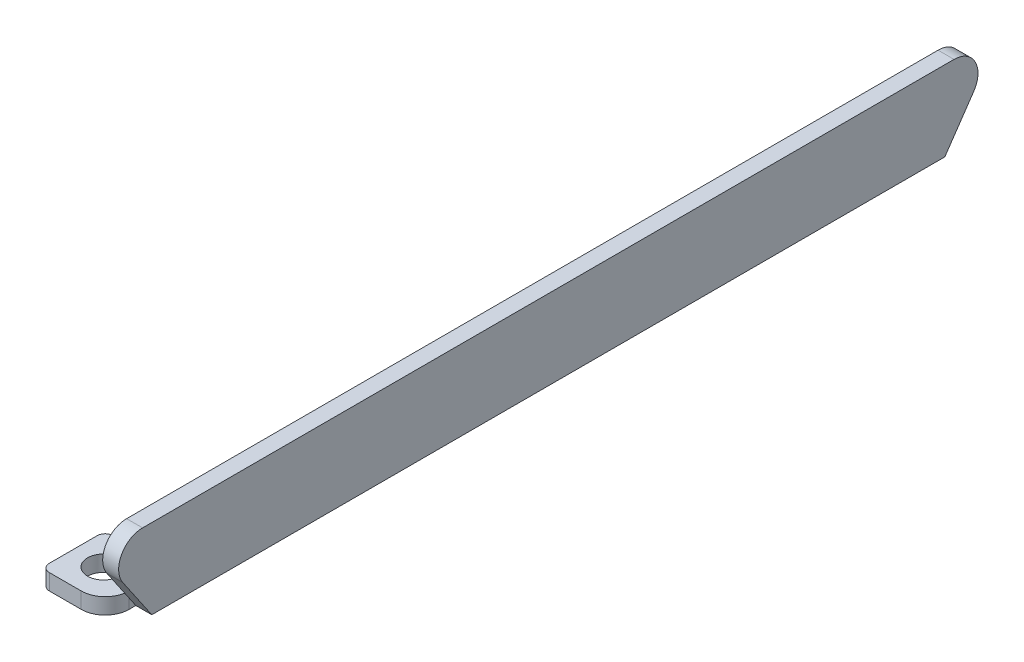
ISO-10303-21;
HEADER;
FILE_DESCRIPTION(('STEP AP214'),'2;1');
FILE_NAME('part.step','',(''),(''),'','','');
FILE_SCHEMA(('AUTOMOTIVE_DESIGN { 1 0 10303 214 1 1 1 1 }'));
ENDSEC;
DATA;
#1=APPLICATION_CONTEXT('core data for automotive mechanical design processes');
#2=APPLICATION_PROTOCOL_DEFINITION('international standard','automotive_design',2000,#1);
#3=PRODUCT_CONTEXT('',#1,'mechanical');
#4=PRODUCT('Part','Part','',(#3));
#5=PRODUCT_RELATED_PRODUCT_CATEGORY('part','',(#4));
#6=PRODUCT_DEFINITION_FORMATION('','',#4);
#7=PRODUCT_DEFINITION_CONTEXT('part definition',#1,'design');
#8=PRODUCT_DEFINITION('design','',#6,#7);
#9=PRODUCT_DEFINITION_SHAPE('','',#8);
#10=(LENGTH_UNIT() NAMED_UNIT(*) SI_UNIT(.MILLI.,.METRE.));
#11=(NAMED_UNIT(*) PLANE_ANGLE_UNIT() SI_UNIT($,.RADIAN.));
#12=(NAMED_UNIT(*) SI_UNIT($,.STERADIAN.) SOLID_ANGLE_UNIT());
#13=UNCERTAINTY_MEASURE_WITH_UNIT(LENGTH_MEASURE(1.E-05),#10,'distance_accuracy_value','');
#14=(GEOMETRIC_REPRESENTATION_CONTEXT(3) GLOBAL_UNCERTAINTY_ASSIGNED_CONTEXT((#13)) GLOBAL_UNIT_ASSIGNED_CONTEXT((#10,
#11,#12)) REPRESENTATION_CONTEXT('',''));
#15=CARTESIAN_POINT('',(0.,0.,0.));
#16=DIRECTION('',(0.,0.,1.));
#17=DIRECTION('',(1.,0.,0.));
#18=AXIS2_PLACEMENT_3D('',#15,#16,#17);
#19=CARTESIAN_POINT('',(-9.,31.3979002575924,-46.4999999999999));
#20=DIRECTION('',(0.,-1.,0.));
#21=DIRECTION('',(0.,0.,-1.));
#22=AXIS2_PLACEMENT_3D('',#19,#20,#21);
#23=PLANE('',#22);
#24=DIRECTION('',(0.,0.,-1.));
#25=VECTOR('',#24,1.);
#26=CARTESIAN_POINT('',(-2.00000000000001,31.3979002575924,-49.6622553863262));
#27=LINE('',#26,#25);
#28=CARTESIAN_POINT('',(-2.00000000000001,31.3979002575924,-45.4999999999999));
#29=VERTEX_POINT('',#28);
#30=CARTESIAN_POINT('',(-2.00000000000001,31.3979002575924,-50.5));
#31=VERTEX_POINT('',#30);
#32=EDGE_CURVE('E239',#29,#31,#27,.T.);
#33=ORIENTED_EDGE('',*,*,#32,.T.);
#34=CARTESIAN_POINT('',(-5.00000000000001,31.3979002575924,-50.5));
#35=DIRECTION('',(0.,-1.,0.));
#36=DIRECTION('',(0.,0.,-1.));
#37=AXIS2_PLACEMENT_3D('',#34,#35,#36);
#38=CIRCLE('',#37,3.);
#39=CARTESIAN_POINT('',(-5.00000000000008,31.3979002575924,-53.5000000000001));
#40=VERTEX_POINT('',#39);
#41=EDGE_CURVE('E333',#31,#40,#38,.F.);
#42=ORIENTED_EDGE('',*,*,#41,.T.);
#43=DIRECTION('',(-1.,0.,0.));
#44=VECTOR('',#43,1.);
#45=CARTESIAN_POINT('',(-2.0000000000001,31.3979002575924,-53.5000000000001));
#46=LINE('',#45,#44);
#47=CARTESIAN_POINT('',(-9.,31.3979002575924,-53.5));
#48=VERTEX_POINT('',#47);
#49=EDGE_CURVE('E237',#40,#48,#46,.T.);
#50=ORIENTED_EDGE('',*,*,#49,.T.);
#51=CARTESIAN_POINT('',(-9.,31.3979002575924,-52.5));
#52=DIRECTION('',(0.,-1.,0.));
#53=DIRECTION('',(0.,0.,-1.));
#54=AXIS2_PLACEMENT_3D('',#51,#52,#53);
#55=CIRCLE('',#54,0.999999999999997);
#56=CARTESIAN_POINT('',(-9.99999999999999,31.3979002575924,-52.5));
#57=VERTEX_POINT('',#56);
#58=EDGE_CURVE('E234',#57,#48,#55,.T.);
#59=ORIENTED_EDGE('',*,*,#58,.F.);
#60=DIRECTION('',(0.,0.,1.));
#61=VECTOR('',#60,1.);
#62=CARTESIAN_POINT('',(-10.,31.3979002575924,-49.6622553863262));
#63=LINE('',#62,#61);
#64=CARTESIAN_POINT('',(-10.,31.3979002575924,-46.5));
#65=VERTEX_POINT('',#64);
#66=EDGE_CURVE('E231',#57,#65,#63,.T.);
#67=ORIENTED_EDGE('',*,*,#66,.T.);
#68=CARTESIAN_POINT('',(-9.,31.3979002575924,-46.4999999999999));
#69=DIRECTION('',(0.,-1.,0.));
#70=DIRECTION('',(0.,0.,-1.));
#71=AXIS2_PLACEMENT_3D('',#68,#69,#70);
#72=CIRCLE('',#71,1.);
#73=CARTESIAN_POINT('',(-9.,31.3979002575924,-45.4999999999999));
#74=VERTEX_POINT('',#73);
#75=EDGE_CURVE('E228',#74,#65,#72,.T.);
#76=ORIENTED_EDGE('',*,*,#75,.F.);
#77=DIRECTION('',(1.,0.,0.));
#78=VECTOR('',#77,1.);
#79=CARTESIAN_POINT('',(-2.,31.3979002575924,-45.4999999999999));
#80=LINE('',#79,#78);
#81=EDGE_CURVE('E242',#74,#29,#80,.T.);
#82=ORIENTED_EDGE('',*,*,#81,.T.);
#83=EDGE_LOOP('',(#33,#42,#50,#59,#67,#76,#82));
#84=FACE_BOUND('',#83,.T.);
#85=CARTESIAN_POINT('',(-6.20230670989599,31.3979002575924,-49.5));
#86=DIRECTION('',(0.,1.,0.));
#87=DIRECTION('',(0.,0.,1.));
#88=AXIS2_PLACEMENT_3D('',#85,#86,#87);
#89=CIRCLE('',#88,2.);
#90=CARTESIAN_POINT('',(-6.20230670989599,31.3979002575924,-47.5));
#91=VERTEX_POINT('',#90);
#92=EDGE_CURVE('E776',#91,#91,#89,.T.);
#93=ORIENTED_EDGE('',*,*,#92,.F.);
#94=EDGE_LOOP('',(#93));
#95=FACE_BOUND('',#94,.T.);
#96=ADVANCED_FACE('F43',(#84,#95),#23,.F.);
#97=CARTESIAN_POINT('',(-2.,0.,0.));
#98=DIRECTION('',(-1.,0.,0.));
#99=DIRECTION('',(0.,0.,1.));
#100=AXIS2_PLACEMENT_3D('',#97,#98,#99);
#101=PLANE('',#100);
#102=DIRECTION('',(0.,0.,-1.));
#103=VECTOR('',#102,1.);
#104=CARTESIAN_POINT('',(-2.,29.3979002575924,-49.6622553863262));
#105=LINE('',#104,#103);
#106=CARTESIAN_POINT('',(-2.,29.3979002575924,45.4999999999999));
#107=VERTEX_POINT('',#106);
#108=CARTESIAN_POINT('',(-2.,29.3979002575924,-45.4999999999999));
#109=VERTEX_POINT('',#108);
#110=EDGE_CURVE('E270',#107,#109,#105,.T.);
#111=ORIENTED_EDGE('',*,*,#110,.F.);
#112=DIRECTION('',(0.,-1.,0.));
#113=VECTOR('',#112,1.);
#114=CARTESIAN_POINT('',(-1.99999999999999,31.3979002575924,45.4999999999999));
#115=LINE('',#114,#113);
#116=CARTESIAN_POINT('',(-1.99999999999999,31.3979002575924,45.4999999999999));
#117=VERTEX_POINT('',#116);
#118=EDGE_CURVE('E192',#117,#107,#115,.T.);
#119=ORIENTED_EDGE('',*,*,#118,.F.);
#120=DIRECTION('',(0.,0.,1.));
#121=VECTOR('',#120,1.);
#122=CARTESIAN_POINT('',(-2.,31.3979002575924,0.));
#123=LINE('',#122,#121);
#124=CARTESIAN_POINT('',(-2.,31.3979002575924,50.5000000000001));
#125=VERTEX_POINT('',#124);
#126=EDGE_CURVE('E314',#117,#125,#123,.T.);
#127=ORIENTED_EDGE('',*,*,#126,.T.);
#128=DIRECTION('',(0.,-1.,0.));
#129=VECTOR('',#128,1.);
#130=CARTESIAN_POINT('',(-1.99999999999999,31.0104886628383,50.5000000000001));
#131=LINE('',#130,#129);
#132=CARTESIAN_POINT('',(-2.,30.6230770680842,50.5000000000001));
#133=VERTEX_POINT('',#132);
#134=EDGE_CURVE('E52',#125,#133,#131,.T.);
#135=ORIENTED_EDGE('',*,*,#134,.T.);
#136=DIRECTION('',(0.,-0.825474980102673,-0.564438709891953));
#137=VECTOR('',#136,1.);
#138=CARTESIAN_POINT('',(-2.,29.3979002575924,49.6622553863262));
#139=LINE('',#138,#137);
#140=CARTESIAN_POINT('',(-2.,34.7045841279165,53.2908302914041));
#141=VERTEX_POINT('',#140);
#142=EDGE_CURVE('E59',#141,#133,#139,.T.);
#143=ORIENTED_EDGE('',*,*,#142,.F.);
#144=CARTESIAN_POINT('',(-2.,36.3979002575924,50.814405351096));
#145=DIRECTION('',(-1.,0.,0.));
#146=DIRECTION('',(0.,0.,1.));
#147=AXIS2_PLACEMENT_3D('',#144,#145,#146);
#148=CIRCLE('',#147,3.);
#149=CARTESIAN_POINT('',(-2.,39.3979002575924,50.814405351096));
#150=VERTEX_POINT('',#149);
#151=EDGE_CURVE('E307',#141,#150,#148,.T.);
#152=ORIENTED_EDGE('',*,*,#151,.T.);
#153=DIRECTION('',(0.,0.,1.));
#154=VECTOR('',#153,1.);
#155=CARTESIAN_POINT('',(-2.,39.3979002575924,-56.5));
#156=LINE('',#155,#154);
#157=CARTESIAN_POINT('',(-2.,39.3979002575924,-50.814405351096));
#158=VERTEX_POINT('',#157);
#159=EDGE_CURVE('E277',#158,#150,#156,.T.);
#160=ORIENTED_EDGE('',*,*,#159,.F.);
#161=CARTESIAN_POINT('',(-2.,36.3979002575924,-50.814405351096));
#162=DIRECTION('',(-1.,0.,0.));
#163=DIRECTION('',(0.,0.,1.));
#164=AXIS2_PLACEMENT_3D('',#161,#162,#163);
#165=CIRCLE('',#164,3.);
#166=CARTESIAN_POINT('',(-2.,34.7045841279165,-53.2908302914041));
#167=VERTEX_POINT('',#166);
#168=EDGE_CURVE('E309',#158,#167,#165,.T.);
#169=ORIENTED_EDGE('',*,*,#168,.T.);
#170=DIRECTION('',(0.,0.825474980102673,-0.564438709891953));
#171=VECTOR('',#170,1.);
#172=CARTESIAN_POINT('',(-2.,29.3979002575924,-49.6622553863262));
#173=LINE('',#172,#171);
#174=CARTESIAN_POINT('',(-2.,30.6230770680842,-50.5));
#175=VERTEX_POINT('',#174);
#176=EDGE_CURVE('E273',#175,#167,#173,.T.);
#177=ORIENTED_EDGE('',*,*,#176,.F.);
#178=DIRECTION('',(0.,-1.,0.));
#179=VECTOR('',#178,1.);
#180=CARTESIAN_POINT('',(-2.00000000000001,31.0104886628383,-50.5));
#181=LINE('',#180,#179);
#182=EDGE_CURVE('E11',#175,#31,#181,.F.);
#183=ORIENTED_EDGE('',*,*,#182,.T.);
#184=ORIENTED_EDGE('',*,*,#32,.F.);
#185=DIRECTION('',(0.,-1.,0.));
#186=VECTOR('',#185,1.);
#187=CARTESIAN_POINT('',(-2.00000000000001,31.3979002575924,-45.4999999999999));
#188=LINE('',#187,#186);
#189=EDGE_CURVE('E260',#29,#109,#188,.T.);
#190=ORIENTED_EDGE('',*,*,#189,.T.);
#191=EDGE_LOOP('',(#111,#119,#127,#135,#143,#152,#160,#169,#177,#183,#184,#190));
#192=FACE_BOUND('',#191,.T.);
#193=ADVANCED_FACE('F339',(#192),#101,.T.);
#194=CARTESIAN_POINT('',(-2.,29.3979002575924,49.6622553863262));
#195=DIRECTION('',(0.,-0.564438709891953,0.825474980102673));
#196=DIRECTION('',(0.,-0.825474980102673,-0.564438709891953));
#197=AXIS2_PLACEMENT_3D('',#194,#195,#196);
#198=PLANE('',#197);
#199=DIRECTION('',(0.,-0.825474980102673,-0.564438709891953));
#200=VECTOR('',#199,1.);
#201=CARTESIAN_POINT('',(0.,29.3979002575924,49.6622553863262));
#202=LINE('',#201,#200);
#203=CARTESIAN_POINT('',(0.,34.7045841279165,53.2908302914041));
#204=VERTEX_POINT('',#203);
#205=CARTESIAN_POINT('',(0.,29.3979002575924,49.6622553863262));
#206=VERTEX_POINT('',#205);
#207=EDGE_CURVE('E259',#204,#206,#202,.T.);
#208=ORIENTED_EDGE('',*,*,#207,.F.);
#209=DIRECTION('',(1.,0.,0.));
#210=VECTOR('',#209,1.);
#211=CARTESIAN_POINT('',(-2.,34.7045841279165,53.2908302914041));
#212=LINE('',#211,#210);
#213=EDGE_CURVE('E312',#204,#141,#212,.F.);
#214=ORIENTED_EDGE('',*,*,#213,.T.);
#215=ORIENTED_EDGE('',*,*,#142,.T.);
#216=CARTESIAN_POINT('',(-1.99999999999999,29.3979002575924,49.6622553863262));
#217=VERTEX_POINT('',#216);
#218=EDGE_CURVE('E271',#133,#217,#139,.T.);
#219=ORIENTED_EDGE('',*,*,#218,.T.);
#220=DIRECTION('',(1.,0.,0.));
#221=VECTOR('',#220,1.);
#222=CARTESIAN_POINT('',(-2.,29.3979002575924,49.6622553863262));
#223=LINE('',#222,#221);
#224=EDGE_CURVE('E280',#217,#206,#223,.T.);
#225=ORIENTED_EDGE('',*,*,#224,.T.);
#226=EDGE_LOOP('',(#208,#214,#215,#219,#225));
#227=FACE_BOUND('',#226,.T.);
#228=ADVANCED_FACE('F418',(#227),#198,.T.);
#229=CARTESIAN_POINT('',(-2.,39.3979002575924,-56.5));
#230=DIRECTION('',(0.,1.,0.));
#231=DIRECTION('',(0.,0.,1.));
#232=AXIS2_PLACEMENT_3D('',#229,#230,#231);
#233=PLANE('',#232);
#234=DIRECTION('',(0.,0.,1.));
#235=VECTOR('',#234,1.);
#236=CARTESIAN_POINT('',(0.,39.3979002575924,-56.5));
#237=LINE('',#236,#235);
#238=CARTESIAN_POINT('',(0.,39.3979002575924,-50.814405351096));
#239=VERTEX_POINT('',#238);
#240=CARTESIAN_POINT('',(0.,39.3979002575924,50.814405351096));
#241=VERTEX_POINT('',#240);
#242=EDGE_CURVE('E288',#239,#241,#237,.T.);
#243=ORIENTED_EDGE('',*,*,#242,.F.);
#244=DIRECTION('',(1.,0.,0.));
#245=VECTOR('',#244,1.);
#246=CARTESIAN_POINT('',(-2.,39.3979002575924,-50.814405351096));
#247=LINE('',#246,#245);
#248=EDGE_CURVE('E305',#239,#158,#247,.F.);
#249=ORIENTED_EDGE('',*,*,#248,.T.);
#250=ORIENTED_EDGE('',*,*,#159,.T.);
#251=DIRECTION('',(1.,0.,0.));
#252=VECTOR('',#251,1.);
#253=CARTESIAN_POINT('',(-2.,39.3979002575924,50.814405351096));
#254=LINE('',#253,#252);
#255=EDGE_CURVE('E302',#150,#241,#254,.T.);
#256=ORIENTED_EDGE('',*,*,#255,.T.);
#257=EDGE_LOOP('',(#243,#249,#250,#256));
#258=FACE_BOUND('',#257,.T.);
#259=ADVANCED_FACE('F649',(#258),#233,.T.);
#260=CARTESIAN_POINT('',(-2.,29.3979002575924,-49.6622553863262));
#261=DIRECTION('',(0.,-0.564438709891953,-0.825474980102673));
#262=DIRECTION('',(0.,0.825474980102673,-0.564438709891953));
#263=AXIS2_PLACEMENT_3D('',#260,#261,#262);
#264=PLANE('',#263);
#265=CARTESIAN_POINT('',(-2.,29.3979002575924,-49.6622553863262));
#266=VERTEX_POINT('',#265);
#267=EDGE_CURVE('E274',#266,#175,#173,.T.);
#268=ORIENTED_EDGE('',*,*,#267,.T.);
#269=ORIENTED_EDGE('',*,*,#176,.T.);
#270=DIRECTION('',(1.,0.,0.));
#271=VECTOR('',#270,1.);
#272=CARTESIAN_POINT('',(-2.,34.7045841279165,-53.2908302914041));
#273=LINE('',#272,#271);
#274=CARTESIAN_POINT('',(0.,34.7045841279165,-53.2908302914041));
#275=VERTEX_POINT('',#274);
#276=EDGE_CURVE('E293',#167,#275,#273,.T.);
#277=ORIENTED_EDGE('',*,*,#276,.T.);
#278=DIRECTION('',(0.,0.825474980102673,-0.564438709891953));
#279=VECTOR('',#278,1.);
#280=CARTESIAN_POINT('',(0.,29.3979002575924,-49.6622553863262));
#281=LINE('',#280,#279);
#282=CARTESIAN_POINT('',(0.,29.3979002575924,-49.6622553863262));
#283=VERTEX_POINT('',#282);
#284=EDGE_CURVE('E285',#283,#275,#281,.T.);
#285=ORIENTED_EDGE('',*,*,#284,.F.);
#286=DIRECTION('',(1.,0.,0.));
#287=VECTOR('',#286,1.);
#288=CARTESIAN_POINT('',(-2.,29.3979002575924,-49.6622553863262));
#289=LINE('',#288,#287);
#290=EDGE_CURVE('E291',#266,#283,#289,.T.);
#291=ORIENTED_EDGE('',*,*,#290,.F.);
#292=EDGE_LOOP('',(#268,#269,#277,#285,#291));
#293=FACE_BOUND('',#292,.T.);
#294=ADVANCED_FACE('F632',(#293),#264,.T.);
#295=CARTESIAN_POINT('',(-2.,29.3979002575924,-49.6622553863262));
#296=DIRECTION('',(0.,-1.,0.));
#297=DIRECTION('',(0.,0.,-1.));
#298=AXIS2_PLACEMENT_3D('',#295,#296,#297);
#299=PLANE('',#298);
#300=CARTESIAN_POINT('',(-6.20230670989599,29.3979002575924,-49.5));
#301=DIRECTION('',(0.,-1.,0.));
#302=DIRECTION('',(0.,0.,-1.));
#303=AXIS2_PLACEMENT_3D('',#300,#301,#302);
#304=CIRCLE('',#303,2.);
#305=CARTESIAN_POINT('',(-6.20230670989599,29.3979002575924,-51.5));
#306=VERTEX_POINT('',#305);
#307=EDGE_CURVE('E764',#306,#306,#304,.T.);
#308=ORIENTED_EDGE('',*,*,#307,.F.);
#309=EDGE_LOOP('',(#308));
#310=FACE_BOUND('',#309,.T.);
#311=CARTESIAN_POINT('',(-6.20230670989598,29.3979002575924,49.5));
#312=DIRECTION('',(0.,-1.,0.));
#313=DIRECTION('',(0.,0.,-1.));
#314=AXIS2_PLACEMENT_3D('',#311,#312,#313);
#315=CIRCLE('',#314,2.);
#316=CARTESIAN_POINT('',(-6.20230670989598,29.3979002575924,47.5));
#317=VERTEX_POINT('',#316);
#318=EDGE_CURVE('E193',#317,#317,#315,.T.);
#319=ORIENTED_EDGE('',*,*,#318,.F.);
#320=EDGE_LOOP('',(#319));
#321=FACE_BOUND('',#320,.T.);
#322=DIRECTION('',(0.,0.,-1.));
#323=VECTOR('',#322,1.);
#324=CARTESIAN_POINT('',(-2.,29.3979002575924,-49.6622553863262));
#325=LINE('',#324,#323);
#326=CARTESIAN_POINT('',(-1.99999999999999,29.3979002575924,50.5000000000001));
#327=VERTEX_POINT('',#326);
#328=EDGE_CURVE('E202',#327,#217,#325,.T.);
#329=ORIENTED_EDGE('',*,*,#328,.F.);
#330=CARTESIAN_POINT('',(-4.99999999999999,29.3979002575924,50.5000000000001));
#331=DIRECTION('',(0.,-1.,0.));
#332=DIRECTION('',(0.,0.,-1.));
#333=AXIS2_PLACEMENT_3D('',#330,#331,#332);
#334=CIRCLE('',#333,3.);
#335=CARTESIAN_POINT('',(-5.00000000000005,29.3979002575924,53.5000000000001));
#336=VERTEX_POINT('',#335);
#337=EDGE_CURVE('E201',#327,#336,#334,.T.);
#338=ORIENTED_EDGE('',*,*,#337,.T.);
#339=DIRECTION('',(1.,0.,0.));
#340=VECTOR('',#339,1.);
#341=CARTESIAN_POINT('',(-2.00000000000194,29.3979002575924,53.5000000000001));
#342=LINE('',#341,#340);
#343=CARTESIAN_POINT('',(-9.,29.3979002575924,53.5));
#344=VERTEX_POINT('',#343);
#345=EDGE_CURVE('E184',#344,#336,#342,.T.);
#346=ORIENTED_EDGE('',*,*,#345,.F.);
#347=CARTESIAN_POINT('',(-9.,29.3979002575924,52.5));
#348=DIRECTION('',(0.,-1.,0.));
#349=DIRECTION('',(0.,0.,-1.));
#350=AXIS2_PLACEMENT_3D('',#347,#348,#349);
#351=CIRCLE('',#350,1.);
#352=CARTESIAN_POINT('',(-10.,29.3979002575924,52.5));
#353=VERTEX_POINT('',#352);
#354=EDGE_CURVE('E200',#344,#353,#351,.T.);
#355=ORIENTED_EDGE('',*,*,#354,.T.);
#356=DIRECTION('',(0.,0.,1.));
#357=VECTOR('',#356,1.);
#358=CARTESIAN_POINT('',(-10.,29.3979002575924,-49.6622553863262));
#359=LINE('',#358,#357);
#360=CARTESIAN_POINT('',(-10.,29.3979002575924,46.5));
#361=VERTEX_POINT('',#360);
#362=EDGE_CURVE('E210',#361,#353,#359,.T.);
#363=ORIENTED_EDGE('',*,*,#362,.F.);
#364=CARTESIAN_POINT('',(-9.,29.3979002575924,46.5));
#365=DIRECTION('',(0.,-1.,0.));
#366=DIRECTION('',(0.,0.,-1.));
#367=AXIS2_PLACEMENT_3D('',#364,#365,#366);
#368=CIRCLE('',#367,1.);
#369=CARTESIAN_POINT('',(-9.,29.3979002575924,45.5));
#370=VERTEX_POINT('',#369);
#371=EDGE_CURVE('E215',#361,#370,#368,.T.);
#372=ORIENTED_EDGE('',*,*,#371,.T.);
#373=DIRECTION('',(-1.,0.,0.));
#374=VECTOR('',#373,1.);
#375=CARTESIAN_POINT('',(-1.99999999999934,29.3979002575924,45.4999999999999));
#376=LINE('',#375,#374);
#377=EDGE_CURVE('E349',#107,#370,#376,.T.);
#378=ORIENTED_EDGE('',*,*,#377,.F.);
#379=ORIENTED_EDGE('',*,*,#110,.T.);
#380=DIRECTION('',(1.,0.,0.));
#381=VECTOR('',#380,1.);
#382=CARTESIAN_POINT('',(-2.,29.3979002575924,-45.4999999999999));
#383=LINE('',#382,#381);
#384=CARTESIAN_POINT('',(-9.,29.3979002575924,-45.4999999999999));
#385=VERTEX_POINT('',#384);
#386=EDGE_CURVE('E232',#385,#109,#383,.T.);
#387=ORIENTED_EDGE('',*,*,#386,.F.);
#388=CARTESIAN_POINT('',(-9.,29.3979002575924,-46.4999999999999));
#389=DIRECTION('',(0.,-1.,0.));
#390=DIRECTION('',(0.,0.,-1.));
#391=AXIS2_PLACEMENT_3D('',#388,#389,#390);
#392=CIRCLE('',#391,1.);
#393=CARTESIAN_POINT('',(-10.,29.3979002575924,-46.5));
#394=VERTEX_POINT('',#393);
#395=EDGE_CURVE('E209',#385,#394,#392,.T.);
#396=ORIENTED_EDGE('',*,*,#395,.T.);
#397=DIRECTION('',(0.,0.,1.));
#398=VECTOR('',#397,1.);
#399=CARTESIAN_POINT('',(-10.,29.3979002575924,-49.6622553863262));
#400=LINE('',#399,#398);
#401=CARTESIAN_POINT('',(-9.99999999999999,29.3979002575924,-52.5));
#402=VERTEX_POINT('',#401);
#403=EDGE_CURVE('E213',#402,#394,#400,.T.);
#404=ORIENTED_EDGE('',*,*,#403,.F.);
#405=CARTESIAN_POINT('',(-9.,29.3979002575924,-52.5));
#406=DIRECTION('',(0.,-1.,0.));
#407=DIRECTION('',(0.,0.,-1.));
#408=AXIS2_PLACEMENT_3D('',#405,#406,#407);
#409=CIRCLE('',#408,0.999999999999997);
#410=CARTESIAN_POINT('',(-9.,29.3979002575924,-53.5));
#411=VERTEX_POINT('',#410);
#412=EDGE_CURVE('E247',#402,#411,#409,.T.);
#413=ORIENTED_EDGE('',*,*,#412,.T.);
#414=DIRECTION('',(-1.,0.,0.));
#415=VECTOR('',#414,1.);
#416=CARTESIAN_POINT('',(-2.0000000000001,29.3979002575924,-53.5000000000001));
#417=LINE('',#416,#415);
#418=CARTESIAN_POINT('',(-5.00000000000008,29.3979002575924,-53.5000000000001));
#419=VERTEX_POINT('',#418);
#420=EDGE_CURVE('E250',#419,#411,#417,.T.);
#421=ORIENTED_EDGE('',*,*,#420,.F.);
#422=CARTESIAN_POINT('',(-5.00000000000001,29.3979002575924,-50.5));
#423=DIRECTION('',(0.,-1.,0.));
#424=DIRECTION('',(0.,0.,-1.));
#425=AXIS2_PLACEMENT_3D('',#422,#423,#424);
#426=CIRCLE('',#425,3.);
#427=CARTESIAN_POINT('',(-2.00000000000001,29.3979002575924,-50.5));
#428=VERTEX_POINT('',#427);
#429=EDGE_CURVE('E320',#419,#428,#426,.T.);
#430=ORIENTED_EDGE('',*,*,#429,.T.);
#431=DIRECTION('',(0.,0.,-1.));
#432=VECTOR('',#431,1.);
#433=CARTESIAN_POINT('',(-2.00000000000001,29.3979002575924,-49.6622553863262));
#434=LINE('',#433,#432);
#435=EDGE_CURVE('E252',#266,#428,#434,.T.);
#436=ORIENTED_EDGE('',*,*,#435,.F.);
#437=ORIENTED_EDGE('',*,*,#290,.T.);
#438=DIRECTION('',(0.,0.,-1.));
#439=VECTOR('',#438,1.);
#440=CARTESIAN_POINT('',(0.,29.3979002575924,-49.6622553863262));
#441=LINE('',#440,#439);
#442=EDGE_CURVE('E282',#206,#283,#441,.T.);
#443=ORIENTED_EDGE('',*,*,#442,.F.);
#444=ORIENTED_EDGE('',*,*,#224,.F.);
#445=EDGE_LOOP('',(#329,#338,#346,#355,#363,#372,#378,#379,#387,#396,#404,#413,#421,#430,#436,
#437,#443,#444));
#446=FACE_BOUND('',#445,.T.);
#447=ADVANCED_FACE('F198',(#310,#321,#446),#299,.T.);
#448=CARTESIAN_POINT('',(0.,0.,0.));
#449=DIRECTION('',(-1.,0.,0.));
#450=DIRECTION('',(0.,0.,1.));
#451=AXIS2_PLACEMENT_3D('',#448,#449,#450);
#452=PLANE('',#451);
#453=ORIENTED_EDGE('',*,*,#284,.T.);
#454=CARTESIAN_POINT('',(0.,36.3979002575924,-50.814405351096));
#455=DIRECTION('',(-1.,0.,0.));
#456=DIRECTION('',(0.,0.,1.));
#457=AXIS2_PLACEMENT_3D('',#454,#455,#456);
#458=CIRCLE('',#457,3.);
#459=EDGE_CURVE('E300',#275,#239,#458,.F.);
#460=ORIENTED_EDGE('',*,*,#459,.T.);
#461=ORIENTED_EDGE('',*,*,#242,.T.);
#462=CARTESIAN_POINT('',(0.,36.3979002575924,50.814405351096));
#463=DIRECTION('',(-1.,0.,0.));
#464=DIRECTION('',(0.,0.,1.));
#465=AXIS2_PLACEMENT_3D('',#462,#463,#464);
#466=CIRCLE('',#465,3.);
#467=EDGE_CURVE('E298',#241,#204,#466,.F.);
#468=ORIENTED_EDGE('',*,*,#467,.T.);
#469=ORIENTED_EDGE('',*,*,#207,.T.);
#470=ORIENTED_EDGE('',*,*,#442,.T.);
#471=EDGE_LOOP('',(#453,#460,#461,#468,#469,#470));
#472=FACE_BOUND('',#471,.T.);
#473=ADVANCED_FACE('F631',(#472),#452,.F.);
#474=CARTESIAN_POINT('',(-2.,36.3979002575924,-50.814405351096));
#475=DIRECTION('',(1.,0.,0.));
#476=DIRECTION('',(0.,0.,-1.));
#477=AXIS2_PLACEMENT_3D('',#474,#475,#476);
#478=CYLINDRICAL_SURFACE('',#477,3.);
#479=ORIENTED_EDGE('',*,*,#168,.F.);
#480=ORIENTED_EDGE('',*,*,#248,.F.);
#481=ORIENTED_EDGE('',*,*,#459,.F.);
#482=ORIENTED_EDGE('',*,*,#276,.F.);
#483=EDGE_LOOP('',(#479,#480,#481,#482));
#484=FACE_BOUND('',#483,.T.);
#485=ADVANCED_FACE('F689',(#484),#478,.T.);
#486=CARTESIAN_POINT('',(-2.,36.3979002575924,50.814405351096));
#487=DIRECTION('',(1.,0.,0.));
#488=DIRECTION('',(0.,0.,-1.));
#489=AXIS2_PLACEMENT_3D('',#486,#487,#488);
#490=CYLINDRICAL_SURFACE('',#489,3.);
#491=ORIENTED_EDGE('',*,*,#151,.F.);
#492=ORIENTED_EDGE('',*,*,#213,.F.);
#493=ORIENTED_EDGE('',*,*,#467,.F.);
#494=ORIENTED_EDGE('',*,*,#255,.F.);
#495=EDGE_LOOP('',(#491,#492,#493,#494));
#496=FACE_BOUND('',#495,.T.);
#497=ADVANCED_FACE('F621',(#496),#490,.T.);
#498=CARTESIAN_POINT('',(-9.,31.3979002575924,-46.4999999999999));
#499=DIRECTION('',(0.,-1.,0.));
#500=DIRECTION('',(0.,0.,-1.));
#501=AXIS2_PLACEMENT_3D('',#498,#499,#500);
#502=CYLINDRICAL_SURFACE('',#501,1.);
#503=ORIENTED_EDGE('',*,*,#395,.F.);
#504=DIRECTION('',(0.,-1.,0.));
#505=VECTOR('',#504,1.);
#506=CARTESIAN_POINT('',(-9.,31.3979002575924,-45.4999999999999));
#507=LINE('',#506,#505);
#508=EDGE_CURVE('E257',#74,#385,#507,.T.);
#509=ORIENTED_EDGE('',*,*,#508,.F.);
#510=ORIENTED_EDGE('',*,*,#75,.T.);
#511=DIRECTION('',(0.,-1.,0.));
#512=VECTOR('',#511,1.);
#513=CARTESIAN_POINT('',(-10.,31.3979002575924,-46.5));
#514=LINE('',#513,#512);
#515=EDGE_CURVE('E243',#65,#394,#514,.T.);
#516=ORIENTED_EDGE('',*,*,#515,.T.);
#517=EDGE_LOOP('',(#503,#509,#510,#516));
#518=FACE_BOUND('',#517,.T.);
#519=ADVANCED_FACE('F377',(#518),#502,.T.);
#520=CARTESIAN_POINT('',(-2.,31.3979002575924,-45.4999999999999));
#521=DIRECTION('',(0.,0.,-1.));
#522=DIRECTION('',(-1.,0.,0.));
#523=AXIS2_PLACEMENT_3D('',#520,#521,#522);
#524=PLANE('',#523);
#525=ORIENTED_EDGE('',*,*,#386,.T.);
#526=ORIENTED_EDGE('',*,*,#189,.F.);
#527=ORIENTED_EDGE('',*,*,#81,.F.);
#528=ORIENTED_EDGE('',*,*,#508,.T.);
#529=EDGE_LOOP('',(#525,#526,#527,#528));
#530=FACE_BOUND('',#529,.T.);
#531=ADVANCED_FACE('F373',(#530),#524,.F.);
#532=CARTESIAN_POINT('',(-2.00000000000001,31.3979002575924,-49.6622553863262));
#533=DIRECTION('',(-1.,0.,0.));
#534=DIRECTION('',(0.,0.,1.));
#535=AXIS2_PLACEMENT_3D('',#532,#533,#534);
#536=PLANE('',#535);
#537=ORIENTED_EDGE('',*,*,#435,.T.);
#538=DIRECTION('',(0.,-1.,0.));
#539=VECTOR('',#538,1.);
#540=CARTESIAN_POINT('',(-2.00000000000001,31.3979002575924,-50.5));
#541=LINE('',#540,#539);
#542=EDGE_CURVE('E330',#428,#175,#541,.F.);
#543=ORIENTED_EDGE('',*,*,#542,.T.);
#544=ORIENTED_EDGE('',*,*,#267,.F.);
#545=EDGE_LOOP('',(#537,#543,#544));
#546=FACE_BOUND('',#545,.T.);
#547=ADVANCED_FACE('F397',(#546),#536,.F.);
#548=CARTESIAN_POINT('',(-2.0000000000001,31.3979002575924,-53.5000000000001));
#549=DIRECTION('',(0.,0.,1.));
#550=DIRECTION('',(1.,0.,0.));
#551=AXIS2_PLACEMENT_3D('',#548,#549,#550);
#552=PLANE('',#551);
#553=ORIENTED_EDGE('',*,*,#49,.F.);
#554=DIRECTION('',(0.,-1.,0.));
#555=VECTOR('',#554,1.);
#556=CARTESIAN_POINT('',(-5.00000000000008,31.3979002575924,-53.5000000000001));
#557=LINE('',#556,#555);
#558=EDGE_CURVE('E327',#40,#419,#557,.T.);
#559=ORIENTED_EDGE('',*,*,#558,.T.);
#560=ORIENTED_EDGE('',*,*,#420,.T.);
#561=DIRECTION('',(0.,-1.,0.));
#562=VECTOR('',#561,1.);
#563=CARTESIAN_POINT('',(-9.,31.3979002575924,-53.5));
#564=LINE('',#563,#562);
#565=EDGE_CURVE('E263',#48,#411,#564,.T.);
#566=ORIENTED_EDGE('',*,*,#565,.F.);
#567=EDGE_LOOP('',(#553,#559,#560,#566));
#568=FACE_BOUND('',#567,.T.);
#569=ADVANCED_FACE('F390',(#568),#552,.F.);
#570=CARTESIAN_POINT('',(-9.,31.3979002575924,-52.5));
#571=DIRECTION('',(0.,-1.,0.));
#572=DIRECTION('',(0.,0.,-1.));
#573=AXIS2_PLACEMENT_3D('',#570,#571,#572);
#574=CYLINDRICAL_SURFACE('',#573,0.999999999999997);
#575=ORIENTED_EDGE('',*,*,#412,.F.);
#576=DIRECTION('',(0.,-1.,0.));
#577=VECTOR('',#576,1.);
#578=CARTESIAN_POINT('',(-9.99999999999999,31.3979002575924,-52.5));
#579=LINE('',#578,#577);
#580=EDGE_CURVE('E266',#57,#402,#579,.T.);
#581=ORIENTED_EDGE('',*,*,#580,.F.);
#582=ORIENTED_EDGE('',*,*,#58,.T.);
#583=ORIENTED_EDGE('',*,*,#565,.T.);
#584=EDGE_LOOP('',(#575,#581,#582,#583));
#585=FACE_BOUND('',#584,.T.);
#586=ADVANCED_FACE('F384',(#585),#574,.T.);
#587=CARTESIAN_POINT('',(-10.,31.3979002575924,-49.6622553863262));
#588=DIRECTION('',(1.,0.,0.));
#589=DIRECTION('',(0.,0.,-1.));
#590=AXIS2_PLACEMENT_3D('',#587,#588,#589);
#591=PLANE('',#590);
#592=ORIENTED_EDGE('',*,*,#403,.T.);
#593=ORIENTED_EDGE('',*,*,#515,.F.);
#594=ORIENTED_EDGE('',*,*,#66,.F.);
#595=ORIENTED_EDGE('',*,*,#580,.T.);
#596=EDGE_LOOP('',(#592,#593,#594,#595));
#597=FACE_BOUND('',#596,.T.);
#598=ADVANCED_FACE('F403',(#597),#591,.F.);
#599=CARTESIAN_POINT('',(-9.,31.3979002575924,52.5));
#600=DIRECTION('',(0.,-1.,0.));
#601=DIRECTION('',(0.,0.,-1.));
#602=AXIS2_PLACEMENT_3D('',#599,#600,#601);
#603=CYLINDRICAL_SURFACE('',#602,1.);
#604=ORIENTED_EDGE('',*,*,#354,.F.);
#605=DIRECTION('',(0.,-1.,0.));
#606=VECTOR('',#605,1.);
#607=CARTESIAN_POINT('',(-9.,31.3979002575924,53.5));
#608=LINE('',#607,#606);
#609=CARTESIAN_POINT('',(-9.,31.3979002575924,53.5));
#610=VERTEX_POINT('',#609);
#611=EDGE_CURVE('E181',#610,#344,#608,.T.);
#612=ORIENTED_EDGE('',*,*,#611,.F.);
#613=CARTESIAN_POINT('',(-9.,31.3979002575924,52.5));
#614=DIRECTION('',(0.,-1.,0.));
#615=DIRECTION('',(0.,0.,-1.));
#616=AXIS2_PLACEMENT_3D('',#613,#614,#615);
#617=CIRCLE('',#616,1.);
#618=CARTESIAN_POINT('',(-10.,31.3979002575924,52.5));
#619=VERTEX_POINT('',#618);
#620=EDGE_CURVE('E203',#610,#619,#617,.T.);
#621=ORIENTED_EDGE('',*,*,#620,.T.);
#622=DIRECTION('',(0.,-1.,0.));
#623=VECTOR('',#622,1.);
#624=CARTESIAN_POINT('',(-10.,31.3979002575924,52.5));
#625=LINE('',#624,#623);
#626=EDGE_CURVE('E207',#619,#353,#625,.T.);
#627=ORIENTED_EDGE('',*,*,#626,.T.);
#628=EDGE_LOOP('',(#604,#612,#621,#627));
#629=FACE_BOUND('',#628,.T.);
#630=ADVANCED_FACE('F205',(#629),#603,.T.);
#631=CARTESIAN_POINT('',(-2.00000000000194,31.3979002575924,53.5000000000001));
#632=DIRECTION('',(0.,0.,-1.));
#633=DIRECTION('',(-1.,0.,0.));
#634=AXIS2_PLACEMENT_3D('',#631,#632,#633);
#635=PLANE('',#634);
#636=ORIENTED_EDGE('',*,*,#345,.T.);
#637=DIRECTION('',(0.,-1.,0.));
#638=VECTOR('',#637,1.);
#639=CARTESIAN_POINT('',(-5.00000000000005,31.3979002575924,53.5000000000001));
#640=LINE('',#639,#638);
#641=CARTESIAN_POINT('',(-5.00000000000005,31.3979002575924,53.5000000000001));
#642=VERTEX_POINT('',#641);
#643=EDGE_CURVE('E323',#336,#642,#640,.F.);
#644=ORIENTED_EDGE('',*,*,#643,.T.);
#645=DIRECTION('',(1.,0.,0.));
#646=VECTOR('',#645,1.);
#647=CARTESIAN_POINT('',(-2.00000000000194,31.3979002575924,53.5000000000001));
#648=LINE('',#647,#646);
#649=EDGE_CURVE('E187',#610,#642,#648,.T.);
#650=ORIENTED_EDGE('',*,*,#649,.F.);
#651=ORIENTED_EDGE('',*,*,#611,.T.);
#652=EDGE_LOOP('',(#636,#644,#650,#651));
#653=FACE_BOUND('',#652,.T.);
#654=ADVANCED_FACE('F183',(#653),#635,.F.);
#655=CARTESIAN_POINT('',(-2.,31.3979002575924,-49.6622553863262));
#656=DIRECTION('',(-1.,0.,0.));
#657=DIRECTION('',(0.,0.,1.));
#658=AXIS2_PLACEMENT_3D('',#655,#656,#657);
#659=PLANE('',#658);
#660=ORIENTED_EDGE('',*,*,#218,.F.);
#661=DIRECTION('',(0.,-1.,0.));
#662=VECTOR('',#661,1.);
#663=CARTESIAN_POINT('',(-1.99999999999999,31.3979002575924,50.5000000000001));
#664=LINE('',#663,#662);
#665=EDGE_CURVE('E317',#133,#327,#664,.T.);
#666=ORIENTED_EDGE('',*,*,#665,.T.);
#667=ORIENTED_EDGE('',*,*,#328,.T.);
#668=EDGE_LOOP('',(#660,#666,#667));
#669=FACE_BOUND('',#668,.T.);
#670=ADVANCED_FACE('F346',(#669),#659,.F.);
#671=CARTESIAN_POINT('',(-1.99999999999934,31.3979002575924,45.4999999999999));
#672=DIRECTION('',(0.,0.,1.));
#673=DIRECTION('',(1.,0.,0.));
#674=AXIS2_PLACEMENT_3D('',#671,#672,#673);
#675=PLANE('',#674);
#676=ORIENTED_EDGE('',*,*,#377,.T.);
#677=DIRECTION('',(0.,-1.,0.));
#678=VECTOR('',#677,1.);
#679=CARTESIAN_POINT('',(-9.,31.3979002575924,45.5));
#680=LINE('',#679,#678);
#681=CARTESIAN_POINT('',(-9.,31.3979002575924,45.5));
#682=VERTEX_POINT('',#681);
#683=EDGE_CURVE('E361',#682,#370,#680,.T.);
#684=ORIENTED_EDGE('',*,*,#683,.F.);
#685=DIRECTION('',(-1.,0.,0.));
#686=VECTOR('',#685,1.);
#687=CARTESIAN_POINT('',(-1.99999999999934,31.3979002575924,45.4999999999999));
#688=LINE('',#687,#686);
#689=EDGE_CURVE('E220',#117,#682,#688,.T.);
#690=ORIENTED_EDGE('',*,*,#689,.F.);
#691=ORIENTED_EDGE('',*,*,#118,.T.);
#692=EDGE_LOOP('',(#676,#684,#690,#691));
#693=FACE_BOUND('',#692,.T.);
#694=ADVANCED_FACE('F366',(#693),#675,.F.);
#695=CARTESIAN_POINT('',(-9.,31.3979002575924,46.5));
#696=DIRECTION('',(0.,-1.,0.));
#697=DIRECTION('',(0.,0.,-1.));
#698=AXIS2_PLACEMENT_3D('',#695,#696,#697);
#699=CYLINDRICAL_SURFACE('',#698,1.);
#700=ORIENTED_EDGE('',*,*,#371,.F.);
#701=DIRECTION('',(0.,-1.,0.));
#702=VECTOR('',#701,1.);
#703=CARTESIAN_POINT('',(-10.,31.3979002575924,46.5));
#704=LINE('',#703,#702);
#705=CARTESIAN_POINT('',(-10.,31.3979002575924,46.5));
#706=VERTEX_POINT('',#705);
#707=EDGE_CURVE('E358',#706,#361,#704,.T.);
#708=ORIENTED_EDGE('',*,*,#707,.F.);
#709=CARTESIAN_POINT('',(-9.,31.3979002575924,46.5));
#710=DIRECTION('',(0.,-1.,0.));
#711=DIRECTION('',(0.,0.,-1.));
#712=AXIS2_PLACEMENT_3D('',#709,#710,#711);
#713=CIRCLE('',#712,1.);
#714=EDGE_CURVE('E222',#706,#682,#713,.T.);
#715=ORIENTED_EDGE('',*,*,#714,.T.);
#716=ORIENTED_EDGE('',*,*,#683,.T.);
#717=EDGE_LOOP('',(#700,#708,#715,#716));
#718=FACE_BOUND('',#717,.T.);
#719=ADVANCED_FACE('F357',(#718),#699,.T.);
#720=CARTESIAN_POINT('',(-10.,31.3979002575924,-49.6622553863262));
#721=DIRECTION('',(1.,0.,0.));
#722=DIRECTION('',(0.,0.,-1.));
#723=AXIS2_PLACEMENT_3D('',#720,#721,#722);
#724=PLANE('',#723);
#725=ORIENTED_EDGE('',*,*,#362,.T.);
#726=ORIENTED_EDGE('',*,*,#626,.F.);
#727=DIRECTION('',(0.,0.,1.));
#728=VECTOR('',#727,1.);
#729=CARTESIAN_POINT('',(-10.,31.3979002575924,-49.6622553863262));
#730=LINE('',#729,#728);
#731=EDGE_CURVE('E225',#706,#619,#730,.T.);
#732=ORIENTED_EDGE('',*,*,#731,.F.);
#733=ORIENTED_EDGE('',*,*,#707,.T.);
#734=EDGE_LOOP('',(#725,#726,#732,#733));
#735=FACE_BOUND('',#734,.T.);
#736=ADVANCED_FACE('F481',(#735),#724,.F.);
#737=CARTESIAN_POINT('',(-9.,31.3979002575924,52.5));
#738=DIRECTION('',(0.,-1.,0.));
#739=DIRECTION('',(0.,0.,-1.));
#740=AXIS2_PLACEMENT_3D('',#737,#738,#739);
#741=PLANE('',#740);
#742=CARTESIAN_POINT('',(-6.20230670989598,31.3979002575924,49.5));
#743=DIRECTION('',(0.,1.,0.));
#744=DIRECTION('',(0.,0.,1.));
#745=AXIS2_PLACEMENT_3D('',#742,#743,#744);
#746=CIRCLE('',#745,2.);
#747=CARTESIAN_POINT('',(-6.20230670989598,31.3979002575924,51.5));
#748=VERTEX_POINT('',#747);
#749=EDGE_CURVE('E767',#748,#748,#746,.T.);
#750=ORIENTED_EDGE('',*,*,#749,.F.);
#751=EDGE_LOOP('',(#750));
#752=FACE_BOUND('',#751,.T.);
#753=ORIENTED_EDGE('',*,*,#649,.T.);
#754=CARTESIAN_POINT('',(-4.99999999999999,31.3979002575924,50.5000000000001));
#755=DIRECTION('',(0.,-1.,0.));
#756=DIRECTION('',(0.,0.,-1.));
#757=AXIS2_PLACEMENT_3D('',#754,#755,#756);
#758=CIRCLE('',#757,3.);
#759=EDGE_CURVE('E325',#642,#125,#758,.F.);
#760=ORIENTED_EDGE('',*,*,#759,.T.);
#761=ORIENTED_EDGE('',*,*,#126,.F.);
#762=ORIENTED_EDGE('',*,*,#689,.T.);
#763=ORIENTED_EDGE('',*,*,#714,.F.);
#764=ORIENTED_EDGE('',*,*,#731,.T.);
#765=ORIENTED_EDGE('',*,*,#620,.F.);
#766=EDGE_LOOP('',(#753,#760,#761,#762,#763,#764,#765));
#767=FACE_BOUND('',#766,.T.);
#768=ADVANCED_FACE('F422',(#752,#767),#741,.F.);
#769=CARTESIAN_POINT('',(-6.20230670989598,31.3979002575924,49.5));
#770=DIRECTION('',(0.,1.,0.));
#771=DIRECTION('',(0.,0.,1.));
#772=AXIS2_PLACEMENT_3D('',#769,#770,#771);
#773=CYLINDRICAL_SURFACE('',#772,2.);
#774=ORIENTED_EDGE('',*,*,#318,.T.);
#775=EDGE_LOOP('',(#774));
#776=FACE_BOUND('',#775,.T.);
#777=ORIENTED_EDGE('',*,*,#749,.T.);
#778=EDGE_LOOP('',(#777));
#779=FACE_BOUND('',#778,.T.);
#780=ADVANCED_FACE('F499',(#776,#779),#773,.F.);
#781=CARTESIAN_POINT('',(-6.20230670989599,31.3979002575924,-49.5));
#782=DIRECTION('',(0.,1.,0.));
#783=DIRECTION('',(0.,0.,1.));
#784=AXIS2_PLACEMENT_3D('',#781,#782,#783);
#785=CYLINDRICAL_SURFACE('',#784,2.);
#786=ORIENTED_EDGE('',*,*,#307,.T.);
#787=EDGE_LOOP('',(#786));
#788=FACE_BOUND('',#787,.T.);
#789=ORIENTED_EDGE('',*,*,#92,.T.);
#790=EDGE_LOOP('',(#789));
#791=FACE_BOUND('',#790,.T.);
#792=ADVANCED_FACE('F508',(#788,#791),#785,.F.);
#793=CARTESIAN_POINT('',(-4.99999999999999,31.3979002575924,50.5000000000001));
#794=DIRECTION('',(0.,-1.,0.));
#795=DIRECTION('',(0.,0.,-1.));
#796=AXIS2_PLACEMENT_3D('',#793,#794,#795);
#797=CYLINDRICAL_SURFACE('',#796,3.);
#798=ORIENTED_EDGE('',*,*,#759,.F.);
#799=ORIENTED_EDGE('',*,*,#643,.F.);
#800=ORIENTED_EDGE('',*,*,#337,.F.);
#801=ORIENTED_EDGE('',*,*,#665,.F.);
#802=ORIENTED_EDGE('',*,*,#134,.F.);
#803=EDGE_LOOP('',(#798,#799,#800,#801,#802));
#804=FACE_BOUND('',#803,.T.);
#805=ADVANCED_FACE('F344',(#804),#797,.T.);
#806=CARTESIAN_POINT('',(-5.00000000000001,31.3979002575924,-50.5));
#807=DIRECTION('',(0.,-1.,0.));
#808=DIRECTION('',(0.,0.,-1.));
#809=AXIS2_PLACEMENT_3D('',#806,#807,#808);
#810=CYLINDRICAL_SURFACE('',#809,3.);
#811=ORIENTED_EDGE('',*,*,#182,.F.);
#812=ORIENTED_EDGE('',*,*,#542,.F.);
#813=ORIENTED_EDGE('',*,*,#429,.F.);
#814=ORIENTED_EDGE('',*,*,#558,.F.);
#815=ORIENTED_EDGE('',*,*,#41,.F.);
#816=EDGE_LOOP('',(#811,#812,#813,#814,#815));
#817=FACE_BOUND('',#816,.T.);
#818=ADVANCED_FACE('F45',(#817),#810,.T.);
#819=CLOSED_SHELL('',(#96,#193,#228,#259,#294,#447,#473,#485,#497,#519,#531,#547,#569,#586,#598,
#630,#654,#670,#694,#719,#736,#768,#780,#792,#805,#818));
#820=MANIFOLD_SOLID_BREP('B2',#819);
#821=ADVANCED_BREP_SHAPE_REPRESENTATION('',(#18,#820),#14);
#822=SHAPE_DEFINITION_REPRESENTATION(#9,#821);
ENDSEC;
END-ISO-10303-21;
